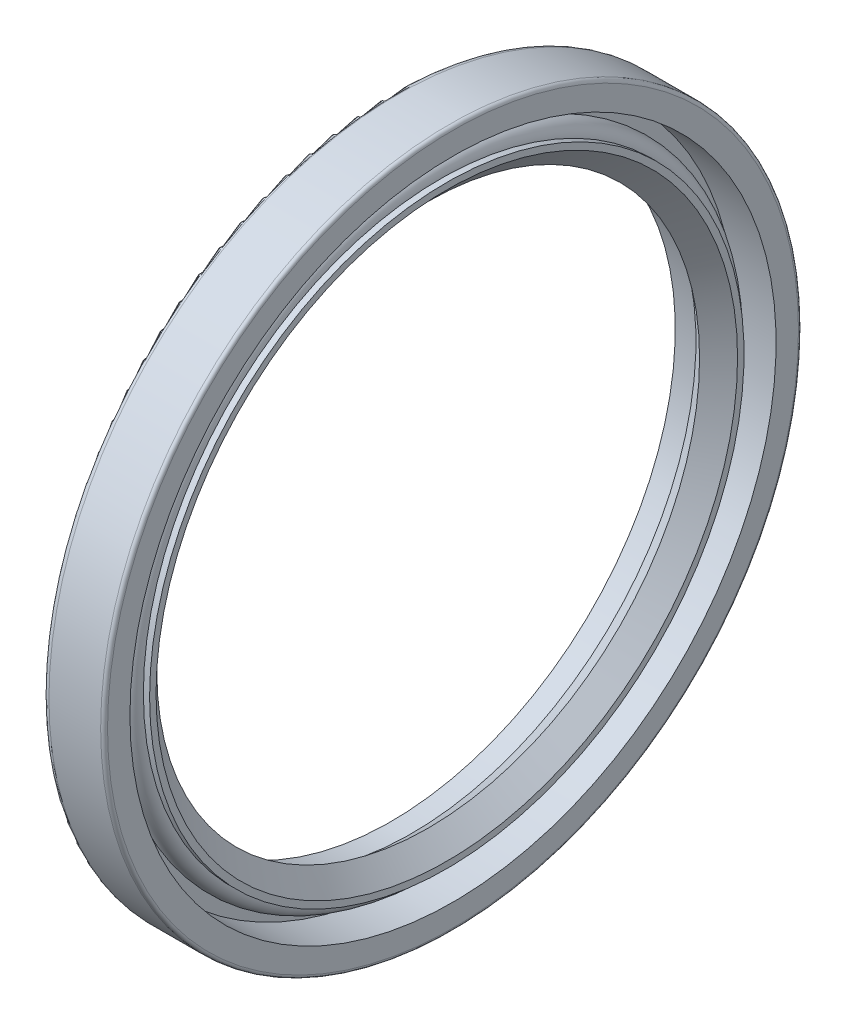
ISO-10303-21;
HEADER;
FILE_DESCRIPTION(('STEP AP214'),'2;1');
FILE_NAME('part.step','',(''),(''),'','','');
FILE_SCHEMA(('AUTOMOTIVE_DESIGN { 1 0 10303 214 1 1 1 1 }'));
ENDSEC;
DATA;
#1=APPLICATION_CONTEXT('core data for automotive mechanical design processes');
#2=APPLICATION_PROTOCOL_DEFINITION('international standard','automotive_design',2000,#1);
#3=PRODUCT_CONTEXT('',#1,'mechanical');
#4=PRODUCT('Part','Part','',(#3));
#5=PRODUCT_RELATED_PRODUCT_CATEGORY('part','',(#4));
#6=PRODUCT_DEFINITION_FORMATION('','',#4);
#7=PRODUCT_DEFINITION_CONTEXT('part definition',#1,'design');
#8=PRODUCT_DEFINITION('design','',#6,#7);
#9=PRODUCT_DEFINITION_SHAPE('','',#8);
#10=(LENGTH_UNIT() NAMED_UNIT(*) SI_UNIT(.MILLI.,.METRE.));
#11=(NAMED_UNIT(*) PLANE_ANGLE_UNIT() SI_UNIT($,.RADIAN.));
#12=(NAMED_UNIT(*) SI_UNIT($,.STERADIAN.) SOLID_ANGLE_UNIT());
#13=UNCERTAINTY_MEASURE_WITH_UNIT(LENGTH_MEASURE(1.E-05),#10,'distance_accuracy_value','');
#14=(GEOMETRIC_REPRESENTATION_CONTEXT(3) GLOBAL_UNCERTAINTY_ASSIGNED_CONTEXT((#13)) GLOBAL_UNIT_ASSIGNED_CONTEXT((#10,
#11,#12)) REPRESENTATION_CONTEXT('',''));
#15=CARTESIAN_POINT('',(0.,0.,0.));
#16=DIRECTION('',(0.,0.,1.));
#17=DIRECTION('',(1.,0.,0.));
#18=AXIS2_PLACEMENT_3D('',#15,#16,#17);
#19=CARTESIAN_POINT('',(1.33333333333287,0.,0.));
#20=DIRECTION('',(-1.,0.,0.));
#21=DIRECTION('',(0.,0.,1.));
#22=AXIS2_PLACEMENT_3D('',#19,#20,#21);
#23=TOROIDAL_SURFACE('',#22,66.1666666666671,1.33333333333288);
#24=CARTESIAN_POINT('',(0.,0.,0.));
#25=DIRECTION('',(-1.,0.,0.));
#26=DIRECTION('',(0.,0.,1.));
#27=AXIS2_PLACEMENT_3D('',#24,#25,#26);
#28=CIRCLE('',#27,66.166666666667);
#29=CARTESIAN_POINT('',(0.,0.,66.166666666667));
#30=VERTEX_POINT('',#29);
#31=EDGE_CURVE('E10',#30,#30,#28,.T.);
#32=ORIENTED_EDGE('',*,*,#31,.F.);
#33=EDGE_LOOP('',(#32));
#34=FACE_BOUND('',#33,.T.);
#35=CARTESIAN_POINT('',(1.3333333333333,0.,0.));
#36=DIRECTION('',(-1.,0.,0.));
#37=DIRECTION('',(0.,0.,1.));
#38=AXIS2_PLACEMENT_3D('',#35,#36,#37);
#39=CIRCLE('',#38,67.5);
#40=CARTESIAN_POINT('',(1.3333333333333,0.,67.5));
#41=VERTEX_POINT('',#40);
#42=EDGE_CURVE('E77',#41,#41,#39,.T.);
#43=ORIENTED_EDGE('',*,*,#42,.T.);
#44=EDGE_LOOP('',(#43));
#45=FACE_BOUND('',#44,.T.);
#46=ADVANCED_FACE('F31',(#34,#45),#23,.T.);
#47=CARTESIAN_POINT('',(0.,66.166666666667,0.));
#48=DIRECTION('',(1.,0.,0.));
#49=DIRECTION('',(0.,0.,-1.));
#50=AXIS2_PLACEMENT_3D('',#47,#48,#49);
#51=PLANE('',#50);
#52=CARTESIAN_POINT('',(0.,0.,0.));
#53=DIRECTION('',(-1.,0.,0.));
#54=DIRECTION('',(0.,0.,1.));
#55=AXIS2_PLACEMENT_3D('',#52,#53,#54);
#56=CIRCLE('',#55,55.);
#57=CARTESIAN_POINT('',(0.,0.,55.));
#58=VERTEX_POINT('',#57);
#59=EDGE_CURVE('E37',#58,#58,#56,.T.);
#60=ORIENTED_EDGE('',*,*,#59,.F.);
#61=EDGE_LOOP('',(#60));
#62=FACE_BOUND('',#61,.T.);
#63=ORIENTED_EDGE('',*,*,#31,.T.);
#64=EDGE_LOOP('',(#63));
#65=FACE_BOUND('',#64,.T.);
#66=ADVANCED_FACE('F150',(#62,#65),#51,.F.);
#67=CARTESIAN_POINT('',(11.333333333333,0.,0.));
#68=DIRECTION('',(-1.,0.,0.));
#69=DIRECTION('',(0.,0.,1.));
#70=AXIS2_PLACEMENT_3D('',#67,#68,#69);
#71=CYLINDRICAL_SURFACE('',#70,55.);
#72=CARTESIAN_POINT('',(4.,0.,0.));
#73=DIRECTION('',(-1.,0.,0.));
#74=DIRECTION('',(0.,0.,1.));
#75=AXIS2_PLACEMENT_3D('',#72,#73,#74);
#76=CIRCLE('',#75,55.);
#77=CARTESIAN_POINT('',(4.,0.,55.));
#78=VERTEX_POINT('',#77);
#79=EDGE_CURVE('E41',#78,#78,#76,.T.);
#80=ORIENTED_EDGE('',*,*,#79,.F.);
#81=EDGE_LOOP('',(#80));
#82=FACE_BOUND('',#81,.T.);
#83=ORIENTED_EDGE('',*,*,#59,.T.);
#84=EDGE_LOOP('',(#83));
#85=FACE_BOUND('',#84,.T.);
#86=ADVANCED_FACE('F145',(#82,#85),#71,.F.);
#87=CARTESIAN_POINT('',(4.,0.,0.));
#88=DIRECTION('',(-1.,0.,0.));
#89=DIRECTION('',(0.,0.,1.));
#90=AXIS2_PLACEMENT_3D('',#87,#88,#89);
#91=CONICAL_SURFACE('',#90,55.,0.663202992706094);
#92=CARTESIAN_POINT('',(7.2,0.,0.));
#93=DIRECTION('',(-1.,0.,0.));
#94=DIRECTION('',(0.,0.,1.));
#95=AXIS2_PLACEMENT_3D('',#92,#93,#94);
#96=CIRCLE('',#95,52.5);
#97=CARTESIAN_POINT('',(7.2,0.,52.5));
#98=VERTEX_POINT('',#97);
#99=EDGE_CURVE('E45',#98,#98,#96,.T.);
#100=ORIENTED_EDGE('',*,*,#99,.F.);
#101=EDGE_LOOP('',(#100));
#102=FACE_BOUND('',#101,.T.);
#103=ORIENTED_EDGE('',*,*,#79,.T.);
#104=EDGE_LOOP('',(#103));
#105=FACE_BOUND('',#104,.T.);
#106=ADVANCED_FACE('F139',(#102,#105),#91,.F.);
#107=CARTESIAN_POINT('',(7.2,0.,0.));
#108=DIRECTION('',(1.,0.,0.));
#109=DIRECTION('',(0.,0.,-1.));
#110=AXIS2_PLACEMENT_3D('',#107,#108,#109);
#111=CONICAL_SURFACE('',#110,52.5,0.805803494083987);
#112=CARTESIAN_POINT('',(10.8,0.,0.));
#113=DIRECTION('',(-1.,0.,0.));
#114=DIRECTION('',(0.,0.,1.));
#115=AXIS2_PLACEMENT_3D('',#112,#113,#114);
#116=CIRCLE('',#115,56.25);
#117=CARTESIAN_POINT('',(10.8,0.,56.25));
#118=VERTEX_POINT('',#117);
#119=EDGE_CURVE('E50',#118,#118,#116,.T.);
#120=ORIENTED_EDGE('',*,*,#119,.F.);
#121=EDGE_LOOP('',(#120));
#122=FACE_BOUND('',#121,.T.);
#123=ORIENTED_EDGE('',*,*,#99,.T.);
#124=EDGE_LOOP('',(#123));
#125=FACE_BOUND('',#124,.T.);
#126=ADVANCED_FACE('F133',(#122,#125),#111,.F.);
#127=CARTESIAN_POINT('',(10.8,56.25,0.));
#128=DIRECTION('',(-1.,0.,0.));
#129=DIRECTION('',(0.,0.,1.));
#130=AXIS2_PLACEMENT_3D('',#127,#128,#129);
#131=PLANE('',#130);
#132=CARTESIAN_POINT('',(10.8,0.,0.));
#133=DIRECTION('',(-1.,0.,0.));
#134=DIRECTION('',(0.,0.,1.));
#135=AXIS2_PLACEMENT_3D('',#132,#133,#134);
#136=CIRCLE('',#135,57.5);
#137=CARTESIAN_POINT('',(10.8,0.,57.5));
#138=VERTEX_POINT('',#137);
#139=EDGE_CURVE('E53',#138,#138,#136,.T.);
#140=ORIENTED_EDGE('',*,*,#139,.F.);
#141=EDGE_LOOP('',(#140));
#142=FACE_BOUND('',#141,.T.);
#143=ORIENTED_EDGE('',*,*,#119,.T.);
#144=EDGE_LOOP('',(#143));
#145=FACE_BOUND('',#144,.T.);
#146=ADVANCED_FACE('F127',(#142,#145),#131,.F.);
#147=CARTESIAN_POINT('',(11.333333333333,0.,0.));
#148=DIRECTION('',(-1.,0.,0.));
#149=DIRECTION('',(0.,0.,1.));
#150=AXIS2_PLACEMENT_3D('',#147,#148,#149);
#151=CYLINDRICAL_SURFACE('',#150,57.5);
#152=CARTESIAN_POINT('',(9.6,0.,0.));
#153=DIRECTION('',(-1.,0.,0.));
#154=DIRECTION('',(0.,0.,1.));
#155=AXIS2_PLACEMENT_3D('',#152,#153,#154);
#156=CIRCLE('',#155,57.5);
#157=CARTESIAN_POINT('',(9.6,0.,57.5));
#158=VERTEX_POINT('',#157);
#159=EDGE_CURVE('E56',#158,#158,#156,.T.);
#160=ORIENTED_EDGE('',*,*,#159,.F.);
#161=EDGE_LOOP('',(#160));
#162=FACE_BOUND('',#161,.T.);
#163=ORIENTED_EDGE('',*,*,#139,.T.);
#164=EDGE_LOOP('',(#163));
#165=FACE_BOUND('',#164,.T.);
#166=ADVANCED_FACE('F121',(#162,#165),#151,.T.);
#167=CARTESIAN_POINT('',(7.2,0.,0.));
#168=DIRECTION('',(-1.,0.,0.));
#169=DIRECTION('',(0.,0.,1.));
#170=AXIS2_PLACEMENT_3D('',#167,#168,#169);
#171=TOROIDAL_SURFACE('',#170,57.5,2.4);
#172=CARTESIAN_POINT('',(4.8,0.,0.));
#173=DIRECTION('',(-1.,0.,0.));
#174=DIRECTION('',(0.,0.,1.));
#175=AXIS2_PLACEMENT_3D('',#172,#173,#174);
#176=CIRCLE('',#175,57.5);
#177=CARTESIAN_POINT('',(4.8,0.,57.5));
#178=VERTEX_POINT('',#177);
#179=EDGE_CURVE('E59',#178,#178,#176,.T.);
#180=ORIENTED_EDGE('',*,*,#179,.F.);
#181=EDGE_LOOP('',(#180));
#182=FACE_BOUND('',#181,.T.);
#183=ORIENTED_EDGE('',*,*,#159,.T.);
#184=EDGE_LOOP('',(#183));
#185=FACE_BOUND('',#184,.T.);
#186=ADVANCED_FACE('F115',(#182,#185),#171,.T.);
#187=CARTESIAN_POINT('',(11.333333333333,0.,0.));
#188=DIRECTION('',(-1.,0.,0.));
#189=DIRECTION('',(0.,0.,1.));
#190=AXIS2_PLACEMENT_3D('',#187,#188,#189);
#191=CYLINDRICAL_SURFACE('',#190,57.5);
#192=CARTESIAN_POINT('',(4.,0.,0.));
#193=DIRECTION('',(-1.,0.,0.));
#194=DIRECTION('',(0.,0.,1.));
#195=AXIS2_PLACEMENT_3D('',#192,#193,#194);
#196=CIRCLE('',#195,57.5);
#197=CARTESIAN_POINT('',(4.,0.,57.5));
#198=VERTEX_POINT('',#197);
#199=EDGE_CURVE('E62',#198,#198,#196,.T.);
#200=ORIENTED_EDGE('',*,*,#199,.F.);
#201=EDGE_LOOP('',(#200));
#202=FACE_BOUND('',#201,.T.);
#203=ORIENTED_EDGE('',*,*,#179,.T.);
#204=EDGE_LOOP('',(#203));
#205=FACE_BOUND('',#204,.T.);
#206=ADVANCED_FACE('F109',(#202,#205),#191,.T.);
#207=CARTESIAN_POINT('',(4.,57.5,0.));
#208=DIRECTION('',(-1.,0.,0.));
#209=DIRECTION('',(0.,0.,1.));
#210=AXIS2_PLACEMENT_3D('',#207,#208,#209);
#211=PLANE('',#210);
#212=CARTESIAN_POINT('',(4.,0.,0.));
#213=DIRECTION('',(-1.,0.,0.));
#214=DIRECTION('',(0.,0.,1.));
#215=AXIS2_PLACEMENT_3D('',#212,#213,#214);
#216=CIRCLE('',#215,62.5);
#217=CARTESIAN_POINT('',(4.,0.,62.5));
#218=VERTEX_POINT('',#217);
#219=EDGE_CURVE('E65',#218,#218,#216,.T.);
#220=ORIENTED_EDGE('',*,*,#219,.F.);
#221=EDGE_LOOP('',(#220));
#222=FACE_BOUND('',#221,.T.);
#223=ORIENTED_EDGE('',*,*,#199,.T.);
#224=EDGE_LOOP('',(#223));
#225=FACE_BOUND('',#224,.T.);
#226=ADVANCED_FACE('F103',(#222,#225),#211,.F.);
#227=CARTESIAN_POINT('',(11.333333333333,0.,0.));
#228=DIRECTION('',(-1.,0.,0.));
#229=DIRECTION('',(0.,0.,1.));
#230=AXIS2_PLACEMENT_3D('',#227,#228,#229);
#231=CYLINDRICAL_SURFACE('',#230,62.5);
#232=CARTESIAN_POINT('',(12.,0.,0.));
#233=DIRECTION('',(-1.,0.,0.));
#234=DIRECTION('',(0.,0.,1.));
#235=AXIS2_PLACEMENT_3D('',#232,#233,#234);
#236=CIRCLE('',#235,62.5);
#237=CARTESIAN_POINT('',(12.,0.,62.5));
#238=VERTEX_POINT('',#237);
#239=EDGE_CURVE('E68',#238,#238,#236,.T.);
#240=ORIENTED_EDGE('',*,*,#239,.F.);
#241=EDGE_LOOP('',(#240));
#242=FACE_BOUND('',#241,.T.);
#243=ORIENTED_EDGE('',*,*,#219,.T.);
#244=EDGE_LOOP('',(#243));
#245=FACE_BOUND('',#244,.T.);
#246=ADVANCED_FACE('F97',(#242,#245),#231,.F.);
#247=CARTESIAN_POINT('',(12.,62.5,0.));
#248=DIRECTION('',(-1.,0.,0.));
#249=DIRECTION('',(0.,0.,1.));
#250=AXIS2_PLACEMENT_3D('',#247,#248,#249);
#251=PLANE('',#250);
#252=CARTESIAN_POINT('',(12.,0.,0.));
#253=DIRECTION('',(-1.,0.,0.));
#254=DIRECTION('',(0.,0.,1.));
#255=AXIS2_PLACEMENT_3D('',#252,#253,#254);
#256=CIRCLE('',#255,66.833333333333);
#257=CARTESIAN_POINT('',(12.,0.,66.833333333333));
#258=VERTEX_POINT('',#257);
#259=EDGE_CURVE('E71',#258,#258,#256,.T.);
#260=ORIENTED_EDGE('',*,*,#259,.F.);
#261=EDGE_LOOP('',(#260));
#262=FACE_BOUND('',#261,.T.);
#263=ORIENTED_EDGE('',*,*,#239,.T.);
#264=EDGE_LOOP('',(#263));
#265=FACE_BOUND('',#264,.T.);
#266=ADVANCED_FACE('F91',(#262,#265),#251,.F.);
#267=CARTESIAN_POINT('',(11.3333333333321,0.,0.));
#268=DIRECTION('',(-1.,0.,0.));
#269=DIRECTION('',(0.,0.,1.));
#270=AXIS2_PLACEMENT_3D('',#267,#268,#269);
#271=TOROIDAL_SURFACE('',#270,66.8333333333321,0.666666666667926);
#272=CARTESIAN_POINT('',(11.333333333333,0.,0.));
#273=DIRECTION('',(-1.,0.,0.));
#274=DIRECTION('',(0.,0.,1.));
#275=AXIS2_PLACEMENT_3D('',#272,#273,#274);
#276=CIRCLE('',#275,67.5);
#277=CARTESIAN_POINT('',(11.333333333333,0.,67.5));
#278=VERTEX_POINT('',#277);
#279=EDGE_CURVE('E74',#278,#278,#276,.T.);
#280=ORIENTED_EDGE('',*,*,#279,.F.);
#281=EDGE_LOOP('',(#280));
#282=FACE_BOUND('',#281,.T.);
#283=ORIENTED_EDGE('',*,*,#259,.T.);
#284=EDGE_LOOP('',(#283));
#285=FACE_BOUND('',#284,.T.);
#286=ADVANCED_FACE('F85',(#282,#285),#271,.T.);
#287=CARTESIAN_POINT('',(11.333333333333,0.,0.));
#288=DIRECTION('',(-1.,0.,0.));
#289=DIRECTION('',(0.,0.,1.));
#290=AXIS2_PLACEMENT_3D('',#287,#288,#289);
#291=CYLINDRICAL_SURFACE('',#290,67.5);
#292=ORIENTED_EDGE('',*,*,#42,.F.);
#293=EDGE_LOOP('',(#292));
#294=FACE_BOUND('',#293,.T.);
#295=ORIENTED_EDGE('',*,*,#279,.T.);
#296=EDGE_LOOP('',(#295));
#297=FACE_BOUND('',#296,.T.);
#298=ADVANCED_FACE('F82',(#294,#297),#291,.T.);
#299=CLOSED_SHELL('',(#46,#66,#86,#106,#126,#146,#166,#186,#206,#226,#246,#266,#286,#298));
#300=MANIFOLD_SOLID_BREP('B2',#299);
#301=ADVANCED_BREP_SHAPE_REPRESENTATION('',(#18,#300),#14);
#302=SHAPE_DEFINITION_REPRESENTATION(#9,#301);
ENDSEC;
END-ISO-10303-21;
